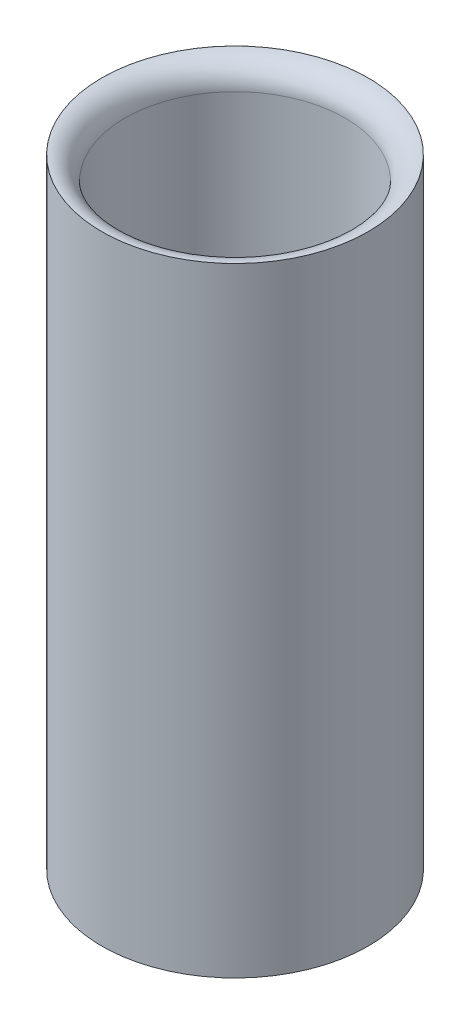
ISO-10303-21;
HEADER;
FILE_DESCRIPTION(('STEP AP214'),'2;1');
FILE_NAME('part.step','',(''),(''),'','','');
FILE_SCHEMA(('AUTOMOTIVE_DESIGN { 1 0 10303 214 1 1 1 1 }'));
ENDSEC;
DATA;
#1=APPLICATION_CONTEXT('core data for automotive mechanical design processes');
#2=APPLICATION_PROTOCOL_DEFINITION('international standard','automotive_design',2000,#1);
#3=PRODUCT_CONTEXT('',#1,'mechanical');
#4=PRODUCT('Part','Part','',(#3));
#5=PRODUCT_RELATED_PRODUCT_CATEGORY('part','',(#4));
#6=PRODUCT_DEFINITION_FORMATION('','',#4);
#7=PRODUCT_DEFINITION_CONTEXT('part definition',#1,'design');
#8=PRODUCT_DEFINITION('design','',#6,#7);
#9=PRODUCT_DEFINITION_SHAPE('','',#8);
#10=(LENGTH_UNIT() NAMED_UNIT(*) SI_UNIT(.MILLI.,.METRE.));
#11=(NAMED_UNIT(*) PLANE_ANGLE_UNIT() SI_UNIT($,.RADIAN.));
#12=(NAMED_UNIT(*) SI_UNIT($,.STERADIAN.) SOLID_ANGLE_UNIT());
#13=UNCERTAINTY_MEASURE_WITH_UNIT(LENGTH_MEASURE(1.E-05),#10,'distance_accuracy_value','');
#14=(GEOMETRIC_REPRESENTATION_CONTEXT(3) GLOBAL_UNCERTAINTY_ASSIGNED_CONTEXT((#13)) GLOBAL_UNIT_ASSIGNED_CONTEXT((#10,
#11,#12)) REPRESENTATION_CONTEXT('',''));
#15=CARTESIAN_POINT('',(0.,0.,0.));
#16=DIRECTION('',(0.,0.,1.));
#17=DIRECTION('',(1.,0.,0.));
#18=AXIS2_PLACEMENT_3D('',#15,#16,#17);
#19=CARTESIAN_POINT('',(0.,-51.8534939759037,0.));
#20=DIRECTION('',(0.,-1.,0.));
#21=DIRECTION('',(1.,0.,0.));
#22=AXIS2_PLACEMENT_3D('',#19,#20,#21);
#23=CYLINDRICAL_SURFACE('',#22,19.02);
#24=CARTESIAN_POINT('',(0.,51.7965060240963,0.));
#25=DIRECTION('',(0.,-1.,0.));
#26=DIRECTION('',(1.,0.,0.));
#27=AXIS2_PLACEMENT_3D('',#24,#25,#26);
#28=CIRCLE('',#27,19.02);
#29=CARTESIAN_POINT('',(19.02,51.7965060240963,0.));
#30=VERTEX_POINT('',#29);
#31=EDGE_CURVE('E10',#30,#30,#28,.T.);
#32=ORIENTED_EDGE('',*,*,#31,.F.);
#33=EDGE_LOOP('',(#32));
#34=FACE_BOUND('',#33,.T.);
#35=CARTESIAN_POINT('',(0.,-41.4114767857722,0.));
#36=DIRECTION('',(0.,-1.,0.));
#37=DIRECTION('',(1.,0.,0.));
#38=AXIS2_PLACEMENT_3D('',#35,#36,#37);
#39=CIRCLE('',#38,19.02);
#40=CARTESIAN_POINT('',(19.02,-41.4114767857722,0.));
#41=VERTEX_POINT('',#40);
#42=EDGE_CURVE('E55',#41,#41,#39,.T.);
#43=ORIENTED_EDGE('',*,*,#42,.T.);
#44=EDGE_LOOP('',(#43));
#45=FACE_BOUND('',#44,.T.);
#46=ADVANCED_FACE('F30',(#34,#45),#23,.F.);
#47=CARTESIAN_POINT('',(0.,51.7965060240964,0.));
#48=DIRECTION('',(0.,-1.,0.));
#49=DIRECTION('',(1.,0.,0.));
#50=AXIS2_PLACEMENT_3D('',#47,#48,#49);
#51=TOROIDAL_SURFACE('',#50,23.02,4.);
#52=CARTESIAN_POINT('',(0.,55.7965060240964,0.));
#53=DIRECTION('',(0.,-1.,0.));
#54=DIRECTION('',(1.,0.,0.));
#55=AXIS2_PLACEMENT_3D('',#52,#53,#54);
#56=CIRCLE('',#55,23.02);
#57=CARTESIAN_POINT('',(23.02,55.7965060240964,0.));
#58=VERTEX_POINT('',#57);
#59=EDGE_CURVE('E36',#58,#58,#56,.T.);
#60=ORIENTED_EDGE('',*,*,#59,.F.);
#61=EDGE_LOOP('',(#60));
#62=FACE_BOUND('',#61,.T.);
#63=ORIENTED_EDGE('',*,*,#31,.T.);
#64=EDGE_LOOP('',(#63));
#65=FACE_BOUND('',#64,.T.);
#66=ADVANCED_FACE('F71',(#62,#65),#51,.T.);
#67=CARTESIAN_POINT('',(-23.02,55.7965060240964,0.));
#68=DIRECTION('',(0.,-1.,0.));
#69=DIRECTION('',(1.,0.,0.));
#70=AXIS2_PLACEMENT_3D('',#67,#68,#69);
#71=PLANE('',#70);
#72=CARTESIAN_POINT('',(0.,55.7965060240964,0.));
#73=DIRECTION('',(0.,-1.,0.));
#74=DIRECTION('',(1.,0.,0.));
#75=AXIS2_PLACEMENT_3D('',#72,#73,#74);
#76=CIRCLE('',#75,23.04);
#77=CARTESIAN_POINT('',(23.04,55.7965060240964,0.));
#78=VERTEX_POINT('',#77);
#79=EDGE_CURVE('E40',#78,#78,#76,.T.);
#80=ORIENTED_EDGE('',*,*,#79,.F.);
#81=EDGE_LOOP('',(#80));
#82=FACE_BOUND('',#81,.T.);
#83=ORIENTED_EDGE('',*,*,#59,.T.);
#84=EDGE_LOOP('',(#83));
#85=FACE_BOUND('',#84,.T.);
#86=ADVANCED_FACE('F76',(#82,#85),#71,.F.);
#87=CARTESIAN_POINT('',(0.,-51.8534939759037,0.));
#88=DIRECTION('',(0.,-1.,0.));
#89=DIRECTION('',(1.,0.,0.));
#90=AXIS2_PLACEMENT_3D('',#87,#88,#89);
#91=CYLINDRICAL_SURFACE('',#90,23.04);
#92=CARTESIAN_POINT('',(0.,-51.2034939759036,0.));
#93=DIRECTION('',(0.,-1.,0.));
#94=DIRECTION('',(1.,0.,0.));
#95=AXIS2_PLACEMENT_3D('',#92,#93,#94);
#96=CIRCLE('',#95,23.04);
#97=CARTESIAN_POINT('',(23.04,-51.2034939759036,0.));
#98=VERTEX_POINT('',#97);
#99=EDGE_CURVE('E44',#98,#98,#96,.T.);
#100=ORIENTED_EDGE('',*,*,#99,.F.);
#101=EDGE_LOOP('',(#100));
#102=FACE_BOUND('',#101,.T.);
#103=ORIENTED_EDGE('',*,*,#79,.T.);
#104=EDGE_LOOP('',(#103));
#105=FACE_BOUND('',#104,.T.);
#106=ADVANCED_FACE('F81',(#102,#105),#91,.T.);
#107=CARTESIAN_POINT('',(-19.02,-51.2034939759036,0.));
#108=DIRECTION('',(0.,1.,0.));
#109=DIRECTION('',(-1.,0.,0.));
#110=AXIS2_PLACEMENT_3D('',#107,#108,#109);
#111=PLANE('',#110);
#112=CARTESIAN_POINT('',(0.,-51.2034939759036,0.));
#113=DIRECTION('',(0.,-1.,0.));
#114=DIRECTION('',(1.,0.,0.));
#115=AXIS2_PLACEMENT_3D('',#112,#113,#114);
#116=CIRCLE('',#115,19.02);
#117=CARTESIAN_POINT('',(19.02,-51.2034939759036,0.));
#118=VERTEX_POINT('',#117);
#119=EDGE_CURVE('E49',#118,#118,#116,.T.);
#120=ORIENTED_EDGE('',*,*,#119,.F.);
#121=EDGE_LOOP('',(#120));
#122=FACE_BOUND('',#121,.T.);
#123=ORIENTED_EDGE('',*,*,#99,.T.);
#124=EDGE_LOOP('',(#123));
#125=FACE_BOUND('',#124,.T.);
#126=ADVANCED_FACE('F87',(#122,#125),#111,.F.);
#127=CARTESIAN_POINT('',(0.,-51.2034939759036,0.));
#128=DIRECTION('',(0.,-1.,0.));
#129=DIRECTION('',(1.,0.,0.));
#130=AXIS2_PLACEMENT_3D('',#127,#128,#129);
#131=CONICAL_SURFACE('',#130,19.02,1.48352986419519);
#132=CARTESIAN_POINT('',(0.,-50.3714767857722,0.));
#133=DIRECTION('',(0.,-1.,0.));
#134=DIRECTION('',(1.,0.,0.));
#135=AXIS2_PLACEMENT_3D('',#132,#133,#134);
#136=CIRCLE('',#135,9.51);
#137=CARTESIAN_POINT('',(9.51,-50.3714767857722,0.));
#138=VERTEX_POINT('',#137);
#139=EDGE_CURVE('E52',#138,#138,#136,.T.);
#140=ORIENTED_EDGE('',*,*,#139,.F.);
#141=EDGE_LOOP('',(#140));
#142=FACE_BOUND('',#141,.T.);
#143=ORIENTED_EDGE('',*,*,#119,.T.);
#144=EDGE_LOOP('',(#143));
#145=FACE_BOUND('',#144,.T.);
#146=ADVANCED_FACE('F67',(#142,#145),#131,.F.);
#147=CARTESIAN_POINT('',(-9.51,-50.3714767857722,0.));
#148=DIRECTION('',(0.,1.,0.));
#149=DIRECTION('',(-1.,0.,0.));
#150=AXIS2_PLACEMENT_3D('',#147,#148,#149);
#151=PLANE('',#150);
#152=ORIENTED_EDGE('',*,*,#139,.T.);
#153=EDGE_LOOP('',(#152));
#154=FACE_BOUND('',#153,.T.);
#155=ADVANCED_FACE('F62',(#154),#151,.F.);
#156=CARTESIAN_POINT('',(0.,-41.4114767857722,0.));
#157=DIRECTION('',(0.,-1.,0.));
#158=DIRECTION('',(1.,0.,0.));
#159=AXIS2_PLACEMENT_3D('',#156,#157,#158);
#160=PLANE('',#159);
#161=ORIENTED_EDGE('',*,*,#42,.F.);
#162=EDGE_LOOP('',(#161));
#163=FACE_BOUND('',#162,.T.);
#164=ADVANCED_FACE('F60',(#163),#160,.F.);
#165=CLOSED_SHELL('',(#46,#66,#86,#106,#126,#146,#155,#164));
#166=MANIFOLD_SOLID_BREP('B2',#165);
#167=ADVANCED_BREP_SHAPE_REPRESENTATION('',(#18,#166),#14);
#168=SHAPE_DEFINITION_REPRESENTATION(#9,#167);
ENDSEC;
END-ISO-10303-21;
